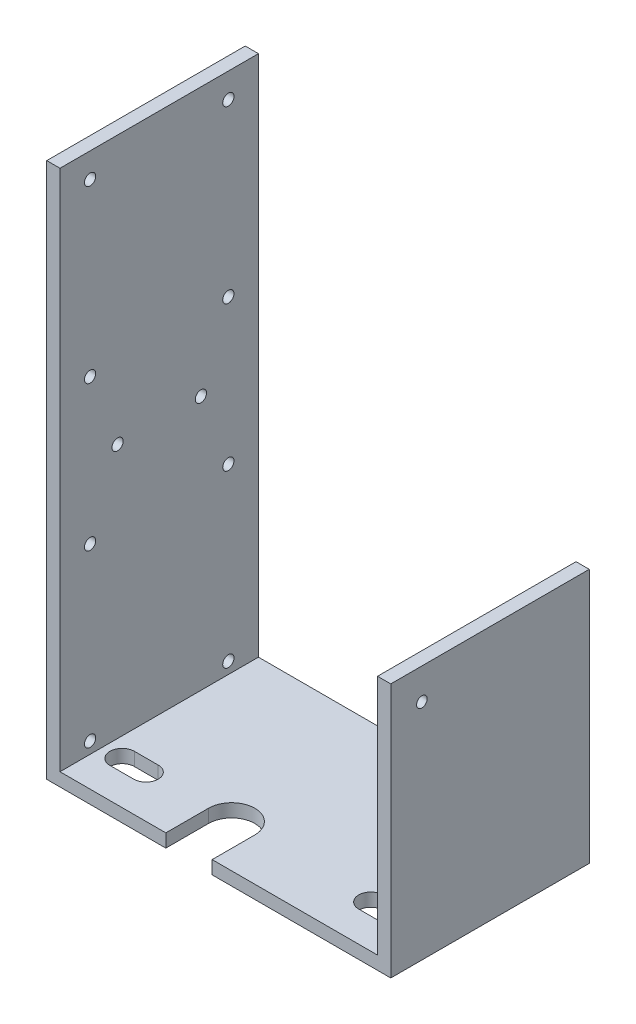
ISO-10303-21;
HEADER;
FILE_DESCRIPTION(('STEP AP214'),'2;1');
FILE_NAME('part.step','',(''),(''),'','','');
FILE_SCHEMA(('AUTOMOTIVE_DESIGN { 1 0 10303 214 1 1 1 1 }'));
ENDSEC;
DATA;
#1=APPLICATION_CONTEXT('core data for automotive mechanical design processes');
#2=APPLICATION_PROTOCOL_DEFINITION('international standard','automotive_design',2000,#1);
#3=PRODUCT_CONTEXT('',#1,'mechanical');
#4=PRODUCT('Part','Part','',(#3));
#5=PRODUCT_RELATED_PRODUCT_CATEGORY('part','',(#4));
#6=PRODUCT_DEFINITION_FORMATION('','',#4);
#7=PRODUCT_DEFINITION_CONTEXT('part definition',#1,'design');
#8=PRODUCT_DEFINITION('design','',#6,#7);
#9=PRODUCT_DEFINITION_SHAPE('','',#8);
#10=(LENGTH_UNIT() NAMED_UNIT(*) SI_UNIT(.MILLI.,.METRE.));
#11=(NAMED_UNIT(*) PLANE_ANGLE_UNIT() SI_UNIT($,.RADIAN.));
#12=(NAMED_UNIT(*) SI_UNIT($,.STERADIAN.) SOLID_ANGLE_UNIT());
#13=UNCERTAINTY_MEASURE_WITH_UNIT(LENGTH_MEASURE(1.E-05),#10,'distance_accuracy_value','');
#14=(GEOMETRIC_REPRESENTATION_CONTEXT(3) GLOBAL_UNCERTAINTY_ASSIGNED_CONTEXT((#13)) GLOBAL_UNIT_ASSIGNED_CONTEXT((#10,
#11,#12)) REPRESENTATION_CONTEXT('',''));
#15=CARTESIAN_POINT('',(0.,0.,0.));
#16=DIRECTION('',(0.,0.,1.));
#17=DIRECTION('',(1.,0.,0.));
#18=AXIS2_PLACEMENT_3D('',#15,#16,#17);
#19=CARTESIAN_POINT('',(0.,0.,30.));
#20=DIRECTION('',(0.,0.,-1.));
#21=DIRECTION('',(-1.,0.,0.));
#22=AXIS2_PLACEMENT_3D('',#19,#20,#21);
#23=PLANE('',#22);
#24=DIRECTION('',(1.,0.,0.));
#25=VECTOR('',#24,1.);
#26=CARTESIAN_POINT('',(52.,0.,30.));
#27=LINE('',#26,#25);
#28=CARTESIAN_POINT('',(0.,0.,30.));
#29=VERTEX_POINT('',#28);
#30=CARTESIAN_POINT('',(18.,0.,30.));
#31=VERTEX_POINT('',#30);
#32=EDGE_CURVE('E325',#29,#31,#27,.T.);
#33=ORIENTED_EDGE('',*,*,#32,.T.);
#34=DIRECTION('',(0.,-1.,0.));
#35=VECTOR('',#34,1.);
#36=CARTESIAN_POINT('',(18.,17.1625360675581,30.));
#37=LINE('',#36,#35);
#38=CARTESIAN_POINT('',(18.,1.99999999999999,30.));
#39=VERTEX_POINT('',#38);
#40=EDGE_CURVE('E197',#39,#31,#37,.T.);
#41=ORIENTED_EDGE('',*,*,#40,.F.);
#42=DIRECTION('',(-1.,0.,0.));
#43=VECTOR('',#42,1.);
#44=CARTESIAN_POINT('',(2.00000000000001,1.99999999999999,30.));
#45=LINE('',#44,#43);
#46=CARTESIAN_POINT('',(2.00000000000001,1.99999999999999,30.));
#47=VERTEX_POINT('',#46);
#48=EDGE_CURVE('E334',#39,#47,#45,.T.);
#49=ORIENTED_EDGE('',*,*,#48,.T.);
#50=DIRECTION('',(0.,1.,0.));
#51=VECTOR('',#50,1.);
#52=CARTESIAN_POINT('',(2.,81.,30.));
#53=LINE('',#52,#51);
#54=CARTESIAN_POINT('',(2.,81.,30.));
#55=VERTEX_POINT('',#54);
#56=EDGE_CURVE('E338',#47,#55,#53,.T.);
#57=ORIENTED_EDGE('',*,*,#56,.T.);
#58=DIRECTION('',(-1.,0.,0.));
#59=VECTOR('',#58,1.);
#60=CARTESIAN_POINT('',(0.,81.,30.));
#61=LINE('',#60,#59);
#62=CARTESIAN_POINT('',(0.,81.,30.));
#63=VERTEX_POINT('',#62);
#64=EDGE_CURVE('E340',#55,#63,#61,.T.);
#65=ORIENTED_EDGE('',*,*,#64,.T.);
#66=DIRECTION('',(0.,-1.,0.));
#67=VECTOR('',#66,1.);
#68=CARTESIAN_POINT('',(0.,0.,30.));
#69=LINE('',#68,#67);
#70=EDGE_CURVE('E342',#63,#29,#69,.T.);
#71=ORIENTED_EDGE('',*,*,#70,.T.);
#72=EDGE_LOOP('',(#33,#41,#49,#57,#65,#71));
#73=FACE_BOUND('',#72,.T.);
#74=ADVANCED_FACE('F33',(#73),#23,.F.);
#75=CARTESIAN_POINT('',(52.,0.,30.));
#76=DIRECTION('',(0.,1.,0.));
#77=DIRECTION('',(-1.,0.,0.));
#78=AXIS2_PLACEMENT_3D('',#75,#76,#77);
#79=PLANE('',#78);
#80=DIRECTION('',(1.,0.,0.));
#81=VECTOR('',#80,1.);
#82=CARTESIAN_POINT('',(42.55,0.,21.7));
#83=LINE('',#82,#81);
#84=CARTESIAN_POINT('',(42.55,0.,21.7));
#85=VERTEX_POINT('',#84);
#86=CARTESIAN_POINT('',(46.15,0.,21.7));
#87=VERTEX_POINT('',#86);
#88=EDGE_CURVE('E212',#85,#87,#83,.T.);
#89=ORIENTED_EDGE('',*,*,#88,.F.);
#90=CARTESIAN_POINT('',(42.55,0.,23.55));
#91=DIRECTION('',(0.,-1.,0.));
#92=DIRECTION('',(1.,0.,0.));
#93=AXIS2_PLACEMENT_3D('',#90,#91,#92);
#94=CIRCLE('',#93,1.85);
#95=CARTESIAN_POINT('',(42.55,0.,25.4));
#96=VERTEX_POINT('',#95);
#97=EDGE_CURVE('E56',#96,#85,#94,.T.);
#98=ORIENTED_EDGE('',*,*,#97,.F.);
#99=DIRECTION('',(-1.,0.,0.));
#100=VECTOR('',#99,1.);
#101=CARTESIAN_POINT('',(42.55,0.,25.4));
#102=LINE('',#101,#100);
#103=CARTESIAN_POINT('',(46.15,0.,25.4));
#104=VERTEX_POINT('',#103);
#105=EDGE_CURVE('E218',#104,#96,#102,.T.);
#106=ORIENTED_EDGE('',*,*,#105,.F.);
#107=CARTESIAN_POINT('',(46.15,0.,23.55));
#108=DIRECTION('',(0.,-1.,0.));
#109=DIRECTION('',(1.,0.,0.));
#110=AXIS2_PLACEMENT_3D('',#107,#108,#109);
#111=CIRCLE('',#110,1.85);
#112=EDGE_CURVE('E215',#87,#104,#111,.T.);
#113=ORIENTED_EDGE('',*,*,#112,.F.);
#114=EDGE_LOOP('',(#89,#98,#106,#113));
#115=FACE_BOUND('',#114,.T.);
#116=DIRECTION('',(1.,0.,0.));
#117=VECTOR('',#116,1.);
#118=CARTESIAN_POINT('',(4.95,0.,21.7));
#119=LINE('',#118,#117);
#120=CARTESIAN_POINT('',(4.95,0.,21.7));
#121=VERTEX_POINT('',#120);
#122=CARTESIAN_POINT('',(8.55,0.,21.7));
#123=VERTEX_POINT('',#122);
#124=EDGE_CURVE('E240',#121,#123,#119,.T.);
#125=ORIENTED_EDGE('',*,*,#124,.F.);
#126=CARTESIAN_POINT('',(4.95,0.,23.55));
#127=DIRECTION('',(0.,-1.,0.));
#128=DIRECTION('',(1.,0.,0.));
#129=AXIS2_PLACEMENT_3D('',#126,#127,#128);
#130=CIRCLE('',#129,1.85);
#131=CARTESIAN_POINT('',(4.95,0.,25.4));
#132=VERTEX_POINT('',#131);
#133=EDGE_CURVE('E229',#132,#121,#130,.T.);
#134=ORIENTED_EDGE('',*,*,#133,.F.);
#135=DIRECTION('',(-1.,0.,0.));
#136=VECTOR('',#135,1.);
#137=CARTESIAN_POINT('',(4.95,0.,25.4));
#138=LINE('',#137,#136);
#139=CARTESIAN_POINT('',(8.55,0.,25.4));
#140=VERTEX_POINT('',#139);
#141=EDGE_CURVE('E246',#140,#132,#138,.T.);
#142=ORIENTED_EDGE('',*,*,#141,.F.);
#143=CARTESIAN_POINT('',(8.55,0.,23.55));
#144=DIRECTION('',(0.,-1.,0.));
#145=DIRECTION('',(1.,0.,0.));
#146=AXIS2_PLACEMENT_3D('',#143,#144,#145);
#147=CIRCLE('',#146,1.85);
#148=EDGE_CURVE('E243',#123,#140,#147,.T.);
#149=ORIENTED_EDGE('',*,*,#148,.F.);
#150=EDGE_LOOP('',(#125,#134,#142,#149));
#151=FACE_BOUND('',#150,.T.);
#152=CARTESIAN_POINT('',(21.5,0.,23.55));
#153=DIRECTION('',(0.,-1.,0.));
#154=DIRECTION('',(1.,0.,0.));
#155=AXIS2_PLACEMENT_3D('',#152,#153,#154);
#156=CIRCLE('',#155,3.5);
#157=CARTESIAN_POINT('',(18.,0.,23.55));
#158=VERTEX_POINT('',#157);
#159=CARTESIAN_POINT('',(25.,0.,23.55));
#160=VERTEX_POINT('',#159);
#161=EDGE_CURVE('E180',#158,#160,#156,.T.);
#162=ORIENTED_EDGE('',*,*,#161,.F.);
#163=DIRECTION('',(0.,0.,-1.));
#164=VECTOR('',#163,1.);
#165=CARTESIAN_POINT('',(18.,0.,23.55));
#166=LINE('',#165,#164);
#167=EDGE_CURVE('E177',#31,#158,#166,.T.);
#168=ORIENTED_EDGE('',*,*,#167,.F.);
#169=ORIENTED_EDGE('',*,*,#32,.F.);
#170=DIRECTION('',(0.,0.,-1.));
#171=VECTOR('',#170,1.);
#172=CARTESIAN_POINT('',(0.,0.,30.));
#173=LINE('',#172,#171);
#174=CARTESIAN_POINT('',(0.,0.,0.));
#175=VERTEX_POINT('',#174);
#176=EDGE_CURVE('E344',#29,#175,#173,.T.);
#177=ORIENTED_EDGE('',*,*,#176,.T.);
#178=DIRECTION('',(1.,0.,0.));
#179=VECTOR('',#178,1.);
#180=CARTESIAN_POINT('',(52.,0.,0.));
#181=LINE('',#180,#179);
#182=CARTESIAN_POINT('',(52.,0.,0.));
#183=VERTEX_POINT('',#182);
#184=EDGE_CURVE('E324',#175,#183,#181,.T.);
#185=ORIENTED_EDGE('',*,*,#184,.T.);
#186=DIRECTION('',(0.,0.,-1.));
#187=VECTOR('',#186,1.);
#188=CARTESIAN_POINT('',(52.,0.,30.));
#189=LINE('',#188,#187);
#190=CARTESIAN_POINT('',(52.,0.,30.));
#191=VERTEX_POINT('',#190);
#192=EDGE_CURVE('E11',#191,#183,#189,.T.);
#193=ORIENTED_EDGE('',*,*,#192,.F.);
#194=CARTESIAN_POINT('',(25.,0.,30.));
#195=VERTEX_POINT('',#194);
#196=EDGE_CURVE('E190',#195,#191,#27,.T.);
#197=ORIENTED_EDGE('',*,*,#196,.F.);
#198=DIRECTION('',(0.,0.,1.));
#199=VECTOR('',#198,1.);
#200=CARTESIAN_POINT('',(25.,0.,23.55));
#201=LINE('',#200,#199);
#202=EDGE_CURVE('E48',#160,#195,#201,.T.);
#203=ORIENTED_EDGE('',*,*,#202,.F.);
#204=EDGE_LOOP('',(#162,#168,#169,#177,#185,#193,#197,#203));
#205=FACE_BOUND('',#204,.T.);
#206=ADVANCED_FACE('F35',(#115,#151,#205),#79,.F.);
#207=CARTESIAN_POINT('',(52.,38.5,30.));
#208=DIRECTION('',(-1.,0.,0.));
#209=DIRECTION('',(0.,-1.,0.));
#210=AXIS2_PLACEMENT_3D('',#207,#208,#209);
#211=PLANE('',#210);
#212=CARTESIAN_POINT('',(52.,33.8,25.3));
#213=DIRECTION('',(1.,0.,0.));
#214=DIRECTION('',(0.,1.,0.));
#215=AXIS2_PLACEMENT_3D('',#212,#213,#214);
#216=CIRCLE('',#215,0.800000000000003);
#217=CARTESIAN_POINT('',(52.,34.6,25.3));
#218=VERTEX_POINT('',#217);
#219=EDGE_CURVE('E318',#218,#218,#216,.T.);
#220=ORIENTED_EDGE('',*,*,#219,.F.);
#221=EDGE_LOOP('',(#220));
#222=FACE_BOUND('',#221,.T.);
#223=DIRECTION('',(0.,1.,0.));
#224=VECTOR('',#223,1.);
#225=CARTESIAN_POINT('',(52.,38.5,0.));
#226=LINE('',#225,#224);
#227=CARTESIAN_POINT('',(52.,38.5,0.));
#228=VERTEX_POINT('',#227);
#229=EDGE_CURVE('E347',#183,#228,#226,.T.);
#230=ORIENTED_EDGE('',*,*,#229,.T.);
#231=DIRECTION('',(0.,0.,-1.));
#232=VECTOR('',#231,1.);
#233=CARTESIAN_POINT('',(52.,38.5,30.));
#234=LINE('',#233,#232);
#235=CARTESIAN_POINT('',(52.,38.5,30.));
#236=VERTEX_POINT('',#235);
#237=EDGE_CURVE('E41',#236,#228,#234,.T.);
#238=ORIENTED_EDGE('',*,*,#237,.F.);
#239=DIRECTION('',(0.,1.,0.));
#240=VECTOR('',#239,1.);
#241=CARTESIAN_POINT('',(52.,38.5,30.));
#242=LINE('',#241,#240);
#243=EDGE_CURVE('E328',#191,#236,#242,.T.);
#244=ORIENTED_EDGE('',*,*,#243,.F.);
#245=ORIENTED_EDGE('',*,*,#192,.T.);
#246=EDGE_LOOP('',(#230,#238,#244,#245));
#247=FACE_BOUND('',#246,.T.);
#248=ADVANCED_FACE('F403',(#222,#247),#211,.F.);
#249=CARTESIAN_POINT('',(50.,38.5,30.));
#250=DIRECTION('',(0.,-1.,0.));
#251=DIRECTION('',(0.,0.,-1.));
#252=AXIS2_PLACEMENT_3D('',#249,#250,#251);
#253=PLANE('',#252);
#254=DIRECTION('',(-1.,0.,0.));
#255=VECTOR('',#254,1.);
#256=CARTESIAN_POINT('',(50.,38.5,0.));
#257=LINE('',#256,#255);
#258=CARTESIAN_POINT('',(50.,38.5,0.));
#259=VERTEX_POINT('',#258);
#260=EDGE_CURVE('E349',#228,#259,#257,.T.);
#261=ORIENTED_EDGE('',*,*,#260,.T.);
#262=DIRECTION('',(0.,0.,-1.));
#263=VECTOR('',#262,1.);
#264=CARTESIAN_POINT('',(50.,38.5,30.));
#265=LINE('',#264,#263);
#266=CARTESIAN_POINT('',(50.,38.5,30.));
#267=VERTEX_POINT('',#266);
#268=EDGE_CURVE('E375',#267,#259,#265,.T.);
#269=ORIENTED_EDGE('',*,*,#268,.F.);
#270=DIRECTION('',(-1.,0.,0.));
#271=VECTOR('',#270,1.);
#272=CARTESIAN_POINT('',(50.,38.5,30.));
#273=LINE('',#272,#271);
#274=EDGE_CURVE('E330',#236,#267,#273,.T.);
#275=ORIENTED_EDGE('',*,*,#274,.F.);
#276=ORIENTED_EDGE('',*,*,#237,.T.);
#277=EDGE_LOOP('',(#261,#269,#275,#276));
#278=FACE_BOUND('',#277,.T.);
#279=ADVANCED_FACE('F382',(#278),#253,.F.);
#280=CARTESIAN_POINT('',(50.,1.99999999999999,30.));
#281=DIRECTION('',(1.,0.,0.));
#282=DIRECTION('',(0.,0.,-1.));
#283=AXIS2_PLACEMENT_3D('',#280,#281,#282);
#284=PLANE('',#283);
#285=CARTESIAN_POINT('',(50.,33.8,25.3));
#286=DIRECTION('',(1.,0.,0.));
#287=DIRECTION('',(0.,0.,-1.));
#288=AXIS2_PLACEMENT_3D('',#285,#286,#287);
#289=CIRCLE('',#288,0.800000000000003);
#290=CARTESIAN_POINT('',(50.,33.8,24.5));
#291=VERTEX_POINT('',#290);
#292=EDGE_CURVE('E321',#291,#291,#289,.F.);
#293=ORIENTED_EDGE('',*,*,#292,.F.);
#294=EDGE_LOOP('',(#293));
#295=FACE_BOUND('',#294,.T.);
#296=DIRECTION('',(0.,-1.,0.));
#297=VECTOR('',#296,1.);
#298=CARTESIAN_POINT('',(50.,1.99999999999999,0.));
#299=LINE('',#298,#297);
#300=CARTESIAN_POINT('',(50.,1.99999999999999,0.));
#301=VERTEX_POINT('',#300);
#302=EDGE_CURVE('E351',#259,#301,#299,.T.);
#303=ORIENTED_EDGE('',*,*,#302,.T.);
#304=DIRECTION('',(0.,0.,-1.));
#305=VECTOR('',#304,1.);
#306=CARTESIAN_POINT('',(50.,1.99999999999999,30.));
#307=LINE('',#306,#305);
#308=CARTESIAN_POINT('',(50.,1.99999999999999,30.));
#309=VERTEX_POINT('',#308);
#310=EDGE_CURVE('E372',#309,#301,#307,.T.);
#311=ORIENTED_EDGE('',*,*,#310,.F.);
#312=DIRECTION('',(0.,-1.,0.));
#313=VECTOR('',#312,1.);
#314=CARTESIAN_POINT('',(50.,1.99999999999999,30.));
#315=LINE('',#314,#313);
#316=EDGE_CURVE('E332',#267,#309,#315,.T.);
#317=ORIENTED_EDGE('',*,*,#316,.F.);
#318=ORIENTED_EDGE('',*,*,#268,.T.);
#319=EDGE_LOOP('',(#303,#311,#317,#318));
#320=FACE_BOUND('',#319,.T.);
#321=ADVANCED_FACE('F394',(#295,#320),#284,.F.);
#322=CARTESIAN_POINT('',(2.00000000000001,1.99999999999999,30.));
#323=DIRECTION('',(0.,-1.,0.));
#324=DIRECTION('',(1.,0.,0.));
#325=AXIS2_PLACEMENT_3D('',#322,#323,#324);
#326=PLANE('',#325);
#327=DIRECTION('',(1.,0.,0.));
#328=VECTOR('',#327,1.);
#329=CARTESIAN_POINT('',(42.55,1.99999999999999,25.4));
#330=LINE('',#329,#328);
#331=CARTESIAN_POINT('',(42.55,1.99999999999999,25.4));
#332=VERTEX_POINT('',#331);
#333=CARTESIAN_POINT('',(46.15,1.99999999999999,25.4));
#334=VERTEX_POINT('',#333);
#335=EDGE_CURVE('E205',#332,#334,#330,.T.);
#336=ORIENTED_EDGE('',*,*,#335,.F.);
#337=CARTESIAN_POINT('',(42.55,1.99999999999999,23.55));
#338=DIRECTION('',(0.,-1.,0.));
#339=DIRECTION('',(1.,0.,0.));
#340=AXIS2_PLACEMENT_3D('',#337,#338,#339);
#341=CIRCLE('',#340,1.85);
#342=CARTESIAN_POINT('',(42.55,1.99999999999999,21.7));
#343=VERTEX_POINT('',#342);
#344=EDGE_CURVE('E208',#343,#332,#341,.F.);
#345=ORIENTED_EDGE('',*,*,#344,.F.);
#346=DIRECTION('',(-1.,0.,0.));
#347=VECTOR('',#346,1.);
#348=CARTESIAN_POINT('',(42.55,1.99999999999999,21.7));
#349=LINE('',#348,#347);
#350=CARTESIAN_POINT('',(46.15,1.99999999999999,21.7));
#351=VERTEX_POINT('',#350);
#352=EDGE_CURVE('E210',#351,#343,#349,.T.);
#353=ORIENTED_EDGE('',*,*,#352,.F.);
#354=CARTESIAN_POINT('',(46.15,1.99999999999999,23.55));
#355=DIRECTION('',(0.,-1.,0.));
#356=DIRECTION('',(1.,0.,0.));
#357=AXIS2_PLACEMENT_3D('',#354,#355,#356);
#358=CIRCLE('',#357,1.85);
#359=EDGE_CURVE('E202',#334,#351,#358,.F.);
#360=ORIENTED_EDGE('',*,*,#359,.F.);
#361=EDGE_LOOP('',(#336,#345,#353,#360));
#362=FACE_BOUND('',#361,.T.);
#363=DIRECTION('',(1.,0.,0.));
#364=VECTOR('',#363,1.);
#365=CARTESIAN_POINT('',(4.95,1.99999999999999,25.4));
#366=LINE('',#365,#364);
#367=CARTESIAN_POINT('',(4.95,1.99999999999999,25.4));
#368=VERTEX_POINT('',#367);
#369=CARTESIAN_POINT('',(8.55,1.99999999999999,25.4));
#370=VERTEX_POINT('',#369);
#371=EDGE_CURVE('E233',#368,#370,#366,.T.);
#372=ORIENTED_EDGE('',*,*,#371,.F.);
#373=CARTESIAN_POINT('',(4.95,1.99999999999999,23.55));
#374=DIRECTION('',(0.,-1.,0.));
#375=DIRECTION('',(1.,0.,0.));
#376=AXIS2_PLACEMENT_3D('',#373,#374,#375);
#377=CIRCLE('',#376,1.85);
#378=CARTESIAN_POINT('',(4.95,1.99999999999999,21.7));
#379=VERTEX_POINT('',#378);
#380=EDGE_CURVE('E236',#379,#368,#377,.F.);
#381=ORIENTED_EDGE('',*,*,#380,.F.);
#382=DIRECTION('',(-1.,0.,0.));
#383=VECTOR('',#382,1.);
#384=CARTESIAN_POINT('',(4.95,1.99999999999999,21.7));
#385=LINE('',#384,#383);
#386=CARTESIAN_POINT('',(8.55,1.99999999999999,21.7));
#387=VERTEX_POINT('',#386);
#388=EDGE_CURVE('E238',#387,#379,#385,.T.);
#389=ORIENTED_EDGE('',*,*,#388,.F.);
#390=CARTESIAN_POINT('',(8.55,1.99999999999999,23.55));
#391=DIRECTION('',(0.,-1.,0.));
#392=DIRECTION('',(1.,0.,0.));
#393=AXIS2_PLACEMENT_3D('',#390,#391,#392);
#394=CIRCLE('',#393,1.85);
#395=EDGE_CURVE('E230',#370,#387,#394,.F.);
#396=ORIENTED_EDGE('',*,*,#395,.F.);
#397=EDGE_LOOP('',(#372,#381,#389,#396));
#398=FACE_BOUND('',#397,.T.);
#399=ORIENTED_EDGE('',*,*,#48,.F.);
#400=DIRECTION('',(0.,0.,1.));
#401=VECTOR('',#400,1.);
#402=CARTESIAN_POINT('',(18.,1.99999999999999,23.55));
#403=LINE('',#402,#401);
#404=CARTESIAN_POINT('',(18.,1.99999999999999,23.55));
#405=VERTEX_POINT('',#404);
#406=EDGE_CURVE('E196',#405,#39,#403,.T.);
#407=ORIENTED_EDGE('',*,*,#406,.F.);
#408=CARTESIAN_POINT('',(21.5,1.99999999999999,23.55));
#409=DIRECTION('',(0.,-1.,0.));
#410=DIRECTION('',(1.,0.,0.));
#411=AXIS2_PLACEMENT_3D('',#408,#409,#410);
#412=CIRCLE('',#411,3.5);
#413=CARTESIAN_POINT('',(25.,1.99999999999999,23.55));
#414=VERTEX_POINT('',#413);
#415=EDGE_CURVE('E201',#414,#405,#412,.F.);
#416=ORIENTED_EDGE('',*,*,#415,.F.);
#417=DIRECTION('',(0.,0.,-1.));
#418=VECTOR('',#417,1.);
#419=CARTESIAN_POINT('',(25.,1.99999999999999,23.55));
#420=LINE('',#419,#418);
#421=CARTESIAN_POINT('',(25.,1.99999999999999,30.));
#422=VERTEX_POINT('',#421);
#423=EDGE_CURVE('E173',#422,#414,#420,.T.);
#424=ORIENTED_EDGE('',*,*,#423,.F.);
#425=EDGE_CURVE('E335',#309,#422,#45,.T.);
#426=ORIENTED_EDGE('',*,*,#425,.F.);
#427=ORIENTED_EDGE('',*,*,#310,.T.);
#428=DIRECTION('',(-1.,0.,0.));
#429=VECTOR('',#428,1.);
#430=CARTESIAN_POINT('',(2.00000000000001,1.99999999999999,0.));
#431=LINE('',#430,#429);
#432=CARTESIAN_POINT('',(2.00000000000001,1.99999999999999,0.));
#433=VERTEX_POINT('',#432);
#434=EDGE_CURVE('E353',#301,#433,#431,.T.);
#435=ORIENTED_EDGE('',*,*,#434,.T.);
#436=DIRECTION('',(0.,0.,-1.));
#437=VECTOR('',#436,1.);
#438=CARTESIAN_POINT('',(2.00000000000001,1.99999999999999,30.));
#439=LINE('',#438,#437);
#440=EDGE_CURVE('E369',#47,#433,#439,.T.);
#441=ORIENTED_EDGE('',*,*,#440,.F.);
#442=EDGE_LOOP('',(#399,#407,#416,#424,#426,#427,#435,#441));
#443=FACE_BOUND('',#442,.T.);
#444=ADVANCED_FACE('F399',(#362,#398,#443),#326,.F.);
#445=CARTESIAN_POINT('',(2.,81.,30.));
#446=DIRECTION('',(-1.,0.,0.));
#447=DIRECTION('',(0.,-1.,0.));
#448=AXIS2_PLACEMENT_3D('',#445,#446,#447);
#449=PLANE('',#448);
#450=CARTESIAN_POINT('',(2.,40.5,21.3));
#451=DIRECTION('',(-1.,0.,0.));
#452=DIRECTION('',(0.,-1.,0.));
#453=AXIS2_PLACEMENT_3D('',#450,#451,#452);
#454=CIRCLE('',#453,0.850000000000001);
#455=CARTESIAN_POINT('',(2.,39.65,21.3));
#456=VERTEX_POINT('',#455);
#457=EDGE_CURVE('E261',#456,#456,#454,.F.);
#458=ORIENTED_EDGE('',*,*,#457,.F.);
#459=EDGE_LOOP('',(#458));
#460=FACE_BOUND('',#459,.T.);
#461=CARTESIAN_POINT('',(2.,40.5,8.7));
#462=DIRECTION('',(-1.,0.,0.));
#463=DIRECTION('',(0.,-1.,0.));
#464=AXIS2_PLACEMENT_3D('',#461,#462,#463);
#465=CIRCLE('',#464,0.850000000000001);
#466=CARTESIAN_POINT('',(2.,39.65,8.7));
#467=VERTEX_POINT('',#466);
#468=EDGE_CURVE('E267',#467,#467,#465,.F.);
#469=ORIENTED_EDGE('',*,*,#468,.F.);
#470=EDGE_LOOP('',(#469));
#471=FACE_BOUND('',#470,.T.);
#472=CARTESIAN_POINT('',(2.00000000000001,3.75,4.55));
#473=DIRECTION('',(-1.,0.,0.));
#474=DIRECTION('',(0.,-1.,0.));
#475=AXIS2_PLACEMENT_3D('',#472,#473,#474);
#476=CIRCLE('',#475,0.850000000000002);
#477=CARTESIAN_POINT('',(2.00000000000001,2.9,4.55));
#478=VERTEX_POINT('',#477);
#479=EDGE_CURVE('E273',#478,#478,#476,.F.);
#480=ORIENTED_EDGE('',*,*,#479,.F.);
#481=EDGE_LOOP('',(#480));
#482=FACE_BOUND('',#481,.T.);
#483=CARTESIAN_POINT('',(2.00000000000001,3.75,25.45));
#484=DIRECTION('',(-1.,0.,0.));
#485=DIRECTION('',(0.,-1.,0.));
#486=AXIS2_PLACEMENT_3D('',#483,#484,#485);
#487=CIRCLE('',#486,0.850000000000001);
#488=CARTESIAN_POINT('',(2.00000000000001,2.9,25.45));
#489=VERTEX_POINT('',#488);
#490=EDGE_CURVE('E279',#489,#489,#487,.F.);
#491=ORIENTED_EDGE('',*,*,#490,.F.);
#492=EDGE_LOOP('',(#491));
#493=FACE_BOUND('',#492,.T.);
#494=CARTESIAN_POINT('',(2.00000000000001,29.55,4.55));
#495=DIRECTION('',(-1.,0.,0.));
#496=DIRECTION('',(0.,-1.,0.));
#497=AXIS2_PLACEMENT_3D('',#494,#495,#496);
#498=CIRCLE('',#497,0.850000000000003);
#499=CARTESIAN_POINT('',(2.00000000000001,28.7,4.55));
#500=VERTEX_POINT('',#499);
#501=EDGE_CURVE('E285',#500,#500,#498,.F.);
#502=ORIENTED_EDGE('',*,*,#501,.F.);
#503=EDGE_LOOP('',(#502));
#504=FACE_BOUND('',#503,.T.);
#505=CARTESIAN_POINT('',(2.00000000000001,29.55,25.45));
#506=DIRECTION('',(-1.,0.,0.));
#507=DIRECTION('',(0.,-1.,0.));
#508=AXIS2_PLACEMENT_3D('',#505,#506,#507);
#509=CIRCLE('',#508,0.850000000000001);
#510=CARTESIAN_POINT('',(2.00000000000001,28.7,25.45));
#511=VERTEX_POINT('',#510);
#512=EDGE_CURVE('E291',#511,#511,#509,.F.);
#513=ORIENTED_EDGE('',*,*,#512,.F.);
#514=EDGE_LOOP('',(#513));
#515=FACE_BOUND('',#514,.T.);
#516=CARTESIAN_POINT('',(2.,51.45,4.55));
#517=DIRECTION('',(-1.,0.,0.));
#518=DIRECTION('',(0.,-1.,0.));
#519=AXIS2_PLACEMENT_3D('',#516,#517,#518);
#520=CIRCLE('',#519,0.850000000000003);
#521=CARTESIAN_POINT('',(2.,50.6,4.55));
#522=VERTEX_POINT('',#521);
#523=EDGE_CURVE('E297',#522,#522,#520,.F.);
#524=ORIENTED_EDGE('',*,*,#523,.F.);
#525=EDGE_LOOP('',(#524));
#526=FACE_BOUND('',#525,.T.);
#527=CARTESIAN_POINT('',(2.,51.45,25.45));
#528=DIRECTION('',(-1.,0.,0.));
#529=DIRECTION('',(0.,-1.,0.));
#530=AXIS2_PLACEMENT_3D('',#527,#528,#529);
#531=CIRCLE('',#530,0.850000000000001);
#532=CARTESIAN_POINT('',(2.,50.6,25.45));
#533=VERTEX_POINT('',#532);
#534=EDGE_CURVE('E303',#533,#533,#531,.F.);
#535=ORIENTED_EDGE('',*,*,#534,.F.);
#536=EDGE_LOOP('',(#535));
#537=FACE_BOUND('',#536,.T.);
#538=CARTESIAN_POINT('',(2.,77.25,25.45));
#539=DIRECTION('',(-1.,0.,0.));
#540=DIRECTION('',(0.,-1.,0.));
#541=AXIS2_PLACEMENT_3D('',#538,#539,#540);
#542=CIRCLE('',#541,0.850000000000001);
#543=CARTESIAN_POINT('',(2.,76.4,25.45));
#544=VERTEX_POINT('',#543);
#545=EDGE_CURVE('E309',#544,#544,#542,.F.);
#546=ORIENTED_EDGE('',*,*,#545,.F.);
#547=EDGE_LOOP('',(#546));
#548=FACE_BOUND('',#547,.T.);
#549=CARTESIAN_POINT('',(2.,77.25,4.55));
#550=DIRECTION('',(-1.,0.,0.));
#551=DIRECTION('',(0.,-1.,0.));
#552=AXIS2_PLACEMENT_3D('',#549,#550,#551);
#553=CIRCLE('',#552,0.850000000000002);
#554=CARTESIAN_POINT('',(2.,76.4,4.55));
#555=VERTEX_POINT('',#554);
#556=EDGE_CURVE('E315',#555,#555,#553,.F.);
#557=ORIENTED_EDGE('',*,*,#556,.F.);
#558=EDGE_LOOP('',(#557));
#559=FACE_BOUND('',#558,.T.);
#560=DIRECTION('',(0.,1.,0.));
#561=VECTOR('',#560,1.);
#562=CARTESIAN_POINT('',(2.,81.,0.));
#563=LINE('',#562,#561);
#564=CARTESIAN_POINT('',(2.,81.,0.));
#565=VERTEX_POINT('',#564);
#566=EDGE_CURVE('E355',#433,#565,#563,.T.);
#567=ORIENTED_EDGE('',*,*,#566,.T.);
#568=DIRECTION('',(0.,0.,-1.));
#569=VECTOR('',#568,1.);
#570=CARTESIAN_POINT('',(2.,81.,30.));
#571=LINE('',#570,#569);
#572=EDGE_CURVE('E366',#55,#565,#571,.T.);
#573=ORIENTED_EDGE('',*,*,#572,.F.);
#574=ORIENTED_EDGE('',*,*,#56,.F.);
#575=ORIENTED_EDGE('',*,*,#440,.T.);
#576=EDGE_LOOP('',(#567,#573,#574,#575));
#577=FACE_BOUND('',#576,.T.);
#578=ADVANCED_FACE('F418',(#460,#471,#482,#493,#504,#515,#526,#537,#548,#559,#577),#449,.F.);
#579=CARTESIAN_POINT('',(0.,81.,30.));
#580=DIRECTION('',(0.,-1.,0.));
#581=DIRECTION('',(0.,0.,-1.));
#582=AXIS2_PLACEMENT_3D('',#579,#580,#581);
#583=PLANE('',#582);
#584=DIRECTION('',(-1.,0.,0.));
#585=VECTOR('',#584,1.);
#586=CARTESIAN_POINT('',(0.,81.,0.));
#587=LINE('',#586,#585);
#588=CARTESIAN_POINT('',(0.,81.,0.));
#589=VERTEX_POINT('',#588);
#590=EDGE_CURVE('E357',#565,#589,#587,.T.);
#591=ORIENTED_EDGE('',*,*,#590,.T.);
#592=DIRECTION('',(0.,0.,-1.));
#593=VECTOR('',#592,1.);
#594=CARTESIAN_POINT('',(0.,81.,30.));
#595=LINE('',#594,#593);
#596=EDGE_CURVE('E363',#63,#589,#595,.T.);
#597=ORIENTED_EDGE('',*,*,#596,.F.);
#598=ORIENTED_EDGE('',*,*,#64,.F.);
#599=ORIENTED_EDGE('',*,*,#572,.T.);
#600=EDGE_LOOP('',(#591,#597,#598,#599));
#601=FACE_BOUND('',#600,.T.);
#602=ADVANCED_FACE('F414',(#601),#583,.F.);
#603=CARTESIAN_POINT('',(0.,0.,30.));
#604=DIRECTION('',(1.,0.,0.));
#605=DIRECTION('',(0.,0.,-1.));
#606=AXIS2_PLACEMENT_3D('',#603,#604,#605);
#607=PLANE('',#606);
#608=CARTESIAN_POINT('',(0.,40.5,21.3));
#609=DIRECTION('',(-1.,0.,0.));
#610=DIRECTION('',(0.,0.,1.));
#611=AXIS2_PLACEMENT_3D('',#608,#609,#610);
#612=CIRCLE('',#611,0.850000000000001);
#613=CARTESIAN_POINT('',(0.,40.5,22.15));
#614=VERTEX_POINT('',#613);
#615=EDGE_CURVE('E258',#614,#614,#612,.T.);
#616=ORIENTED_EDGE('',*,*,#615,.F.);
#617=EDGE_LOOP('',(#616));
#618=FACE_BOUND('',#617,.T.);
#619=CARTESIAN_POINT('',(0.,40.5,8.7));
#620=DIRECTION('',(-1.,0.,0.));
#621=DIRECTION('',(0.,0.,1.));
#622=AXIS2_PLACEMENT_3D('',#619,#620,#621);
#623=CIRCLE('',#622,0.850000000000001);
#624=CARTESIAN_POINT('',(0.,40.5,9.55));
#625=VERTEX_POINT('',#624);
#626=EDGE_CURVE('E264',#625,#625,#623,.T.);
#627=ORIENTED_EDGE('',*,*,#626,.F.);
#628=EDGE_LOOP('',(#627));
#629=FACE_BOUND('',#628,.T.);
#630=CARTESIAN_POINT('',(0.,3.75,4.55));
#631=DIRECTION('',(-1.,0.,0.));
#632=DIRECTION('',(0.,0.,-1.));
#633=AXIS2_PLACEMENT_3D('',#630,#631,#632);
#634=CIRCLE('',#633,0.850000000000002);
#635=CARTESIAN_POINT('',(0.,3.75,3.7));
#636=VERTEX_POINT('',#635);
#637=EDGE_CURVE('E270',#636,#636,#634,.T.);
#638=ORIENTED_EDGE('',*,*,#637,.F.);
#639=EDGE_LOOP('',(#638));
#640=FACE_BOUND('',#639,.T.);
#641=CARTESIAN_POINT('',(0.,3.75,25.45));
#642=DIRECTION('',(-1.,0.,0.));
#643=DIRECTION('',(0.,0.,-1.));
#644=AXIS2_PLACEMENT_3D('',#641,#642,#643);
#645=CIRCLE('',#644,0.850000000000001);
#646=CARTESIAN_POINT('',(0.,3.75,24.6));
#647=VERTEX_POINT('',#646);
#648=EDGE_CURVE('E276',#647,#647,#645,.T.);
#649=ORIENTED_EDGE('',*,*,#648,.F.);
#650=EDGE_LOOP('',(#649));
#651=FACE_BOUND('',#650,.T.);
#652=CARTESIAN_POINT('',(0.,29.55,4.55));
#653=DIRECTION('',(-1.,0.,0.));
#654=DIRECTION('',(0.,0.,-1.));
#655=AXIS2_PLACEMENT_3D('',#652,#653,#654);
#656=CIRCLE('',#655,0.850000000000003);
#657=CARTESIAN_POINT('',(0.,29.55,3.7));
#658=VERTEX_POINT('',#657);
#659=EDGE_CURVE('E282',#658,#658,#656,.T.);
#660=ORIENTED_EDGE('',*,*,#659,.F.);
#661=EDGE_LOOP('',(#660));
#662=FACE_BOUND('',#661,.T.);
#663=CARTESIAN_POINT('',(0.,29.55,25.45));
#664=DIRECTION('',(-1.,0.,0.));
#665=DIRECTION('',(0.,0.,-1.));
#666=AXIS2_PLACEMENT_3D('',#663,#664,#665);
#667=CIRCLE('',#666,0.850000000000001);
#668=CARTESIAN_POINT('',(0.,29.55,24.6));
#669=VERTEX_POINT('',#668);
#670=EDGE_CURVE('E288',#669,#669,#667,.T.);
#671=ORIENTED_EDGE('',*,*,#670,.F.);
#672=EDGE_LOOP('',(#671));
#673=FACE_BOUND('',#672,.T.);
#674=CARTESIAN_POINT('',(0.,51.45,4.55));
#675=DIRECTION('',(-1.,0.,0.));
#676=DIRECTION('',(0.,0.,1.));
#677=AXIS2_PLACEMENT_3D('',#674,#675,#676);
#678=CIRCLE('',#677,0.850000000000003);
#679=CARTESIAN_POINT('',(0.,51.45,5.4));
#680=VERTEX_POINT('',#679);
#681=EDGE_CURVE('E294',#680,#680,#678,.T.);
#682=ORIENTED_EDGE('',*,*,#681,.F.);
#683=EDGE_LOOP('',(#682));
#684=FACE_BOUND('',#683,.T.);
#685=CARTESIAN_POINT('',(0.,51.45,25.45));
#686=DIRECTION('',(-1.,0.,0.));
#687=DIRECTION('',(0.,0.,1.));
#688=AXIS2_PLACEMENT_3D('',#685,#686,#687);
#689=CIRCLE('',#688,0.850000000000001);
#690=CARTESIAN_POINT('',(0.,51.45,26.3));
#691=VERTEX_POINT('',#690);
#692=EDGE_CURVE('E300',#691,#691,#689,.T.);
#693=ORIENTED_EDGE('',*,*,#692,.F.);
#694=EDGE_LOOP('',(#693));
#695=FACE_BOUND('',#694,.T.);
#696=CARTESIAN_POINT('',(0.,77.25,25.45));
#697=DIRECTION('',(-1.,0.,0.));
#698=DIRECTION('',(0.,0.,1.));
#699=AXIS2_PLACEMENT_3D('',#696,#697,#698);
#700=CIRCLE('',#699,0.850000000000001);
#701=CARTESIAN_POINT('',(0.,77.25,26.3));
#702=VERTEX_POINT('',#701);
#703=EDGE_CURVE('E306',#702,#702,#700,.T.);
#704=ORIENTED_EDGE('',*,*,#703,.F.);
#705=EDGE_LOOP('',(#704));
#706=FACE_BOUND('',#705,.T.);
#707=CARTESIAN_POINT('',(0.,77.25,4.55));
#708=DIRECTION('',(-1.,0.,0.));
#709=DIRECTION('',(0.,0.,1.));
#710=AXIS2_PLACEMENT_3D('',#707,#708,#709);
#711=CIRCLE('',#710,0.850000000000002);
#712=CARTESIAN_POINT('',(0.,77.25,5.4));
#713=VERTEX_POINT('',#712);
#714=EDGE_CURVE('E312',#713,#713,#711,.T.);
#715=ORIENTED_EDGE('',*,*,#714,.F.);
#716=EDGE_LOOP('',(#715));
#717=FACE_BOUND('',#716,.T.);
#718=DIRECTION('',(0.,-1.,0.));
#719=VECTOR('',#718,1.);
#720=CARTESIAN_POINT('',(0.,0.,0.));
#721=LINE('',#720,#719);
#722=EDGE_CURVE('E359',#589,#175,#721,.T.);
#723=ORIENTED_EDGE('',*,*,#722,.T.);
#724=ORIENTED_EDGE('',*,*,#176,.F.);
#725=ORIENTED_EDGE('',*,*,#70,.F.);
#726=ORIENTED_EDGE('',*,*,#596,.T.);
#727=EDGE_LOOP('',(#723,#724,#725,#726));
#728=FACE_BOUND('',#727,.T.);
#729=ADVANCED_FACE('F409',(#618,#629,#640,#651,#662,#673,#684,#695,#706,#717,#728),#607,.F.);
#730=ORIENTED_EDGE('',*,*,#425,.T.);
#731=DIRECTION('',(0.,-1.,0.));
#732=VECTOR('',#731,1.);
#733=CARTESIAN_POINT('',(25.,17.1625360675581,30.));
#734=LINE('',#733,#732);
#735=EDGE_CURVE('E176',#422,#195,#734,.T.);
#736=ORIENTED_EDGE('',*,*,#735,.T.);
#737=ORIENTED_EDGE('',*,*,#196,.T.);
#738=ORIENTED_EDGE('',*,*,#243,.T.);
#739=ORIENTED_EDGE('',*,*,#274,.T.);
#740=ORIENTED_EDGE('',*,*,#316,.T.);
#741=EDGE_LOOP('',(#730,#736,#737,#738,#739,#740));
#742=FACE_BOUND('',#741,.T.);
#743=ADVANCED_FACE('F402',(#742),#23,.F.);
#744=CARTESIAN_POINT('',(0.,0.,0.));
#745=DIRECTION('',(0.,0.,-1.));
#746=DIRECTION('',(-1.,0.,0.));
#747=AXIS2_PLACEMENT_3D('',#744,#745,#746);
#748=PLANE('',#747);
#749=ORIENTED_EDGE('',*,*,#184,.F.);
#750=ORIENTED_EDGE('',*,*,#722,.F.);
#751=ORIENTED_EDGE('',*,*,#590,.F.);
#752=ORIENTED_EDGE('',*,*,#566,.F.);
#753=ORIENTED_EDGE('',*,*,#434,.F.);
#754=ORIENTED_EDGE('',*,*,#302,.F.);
#755=ORIENTED_EDGE('',*,*,#260,.F.);
#756=ORIENTED_EDGE('',*,*,#229,.F.);
#757=EDGE_LOOP('',(#749,#750,#751,#752,#753,#754,#755,#756));
#758=FACE_BOUND('',#757,.T.);
#759=ADVANCED_FACE('F389',(#758),#748,.T.);
#760=CARTESIAN_POINT('',(47.737258300203,33.8,25.3));
#761=DIRECTION('',(1.,0.,0.));
#762=DIRECTION('',(0.,1.,0.));
#763=AXIS2_PLACEMENT_3D('',#760,#761,#762);
#764=CYLINDRICAL_SURFACE('',#763,0.800000000000003);
#765=ORIENTED_EDGE('',*,*,#292,.T.);
#766=EDGE_LOOP('',(#765));
#767=FACE_BOUND('',#766,.T.);
#768=ORIENTED_EDGE('',*,*,#219,.T.);
#769=EDGE_LOOP('',(#768));
#770=FACE_BOUND('',#769,.T.);
#771=ADVANCED_FACE('F449',(#767,#770),#764,.F.);
#772=CARTESIAN_POINT('',(4.40416305603428,77.25,4.55));
#773=DIRECTION('',(-1.,0.,0.));
#774=DIRECTION('',(0.,0.,1.));
#775=AXIS2_PLACEMENT_3D('',#772,#773,#774);
#776=CYLINDRICAL_SURFACE('',#775,0.850000000000002);
#777=ORIENTED_EDGE('',*,*,#556,.T.);
#778=EDGE_LOOP('',(#777));
#779=FACE_BOUND('',#778,.T.);
#780=ORIENTED_EDGE('',*,*,#714,.T.);
#781=EDGE_LOOP('',(#780));
#782=FACE_BOUND('',#781,.T.);
#783=ADVANCED_FACE('F478',(#779,#782),#776,.F.);
#784=CARTESIAN_POINT('',(4.40416305603428,77.25,25.45));
#785=DIRECTION('',(-1.,0.,0.));
#786=DIRECTION('',(0.,0.,1.));
#787=AXIS2_PLACEMENT_3D('',#784,#785,#786);
#788=CYLINDRICAL_SURFACE('',#787,0.850000000000001);
#789=ORIENTED_EDGE('',*,*,#545,.T.);
#790=EDGE_LOOP('',(#789));
#791=FACE_BOUND('',#790,.T.);
#792=ORIENTED_EDGE('',*,*,#703,.T.);
#793=EDGE_LOOP('',(#792));
#794=FACE_BOUND('',#793,.T.);
#795=ADVANCED_FACE('F483',(#791,#794),#788,.F.);
#796=CARTESIAN_POINT('',(4.40416305603428,51.45,25.45));
#797=DIRECTION('',(-1.,0.,0.));
#798=DIRECTION('',(0.,0.,1.));
#799=AXIS2_PLACEMENT_3D('',#796,#797,#798);
#800=CYLINDRICAL_SURFACE('',#799,0.850000000000001);
#801=ORIENTED_EDGE('',*,*,#534,.T.);
#802=EDGE_LOOP('',(#801));
#803=FACE_BOUND('',#802,.T.);
#804=ORIENTED_EDGE('',*,*,#692,.T.);
#805=EDGE_LOOP('',(#804));
#806=FACE_BOUND('',#805,.T.);
#807=ADVANCED_FACE('F489',(#803,#806),#800,.F.);
#808=CARTESIAN_POINT('',(4.40416305603428,51.45,4.55));
#809=DIRECTION('',(-1.,0.,0.));
#810=DIRECTION('',(0.,0.,1.));
#811=AXIS2_PLACEMENT_3D('',#808,#809,#810);
#812=CYLINDRICAL_SURFACE('',#811,0.850000000000003);
#813=ORIENTED_EDGE('',*,*,#523,.T.);
#814=EDGE_LOOP('',(#813));
#815=FACE_BOUND('',#814,.T.);
#816=ORIENTED_EDGE('',*,*,#681,.T.);
#817=EDGE_LOOP('',(#816));
#818=FACE_BOUND('',#817,.T.);
#819=ADVANCED_FACE('F493',(#815,#818),#812,.F.);
#820=CARTESIAN_POINT('',(4.40416305603428,29.55,25.45));
#821=DIRECTION('',(-1.,0.,0.));
#822=DIRECTION('',(0.,0.,1.));
#823=AXIS2_PLACEMENT_3D('',#820,#821,#822);
#824=CYLINDRICAL_SURFACE('',#823,0.850000000000001);
#825=ORIENTED_EDGE('',*,*,#512,.T.);
#826=EDGE_LOOP('',(#825));
#827=FACE_BOUND('',#826,.T.);
#828=ORIENTED_EDGE('',*,*,#670,.T.);
#829=EDGE_LOOP('',(#828));
#830=FACE_BOUND('',#829,.T.);
#831=ADVANCED_FACE('F497',(#827,#830),#824,.F.);
#832=CARTESIAN_POINT('',(4.40416305603428,29.55,4.55));
#833=DIRECTION('',(-1.,0.,0.));
#834=DIRECTION('',(0.,0.,1.));
#835=AXIS2_PLACEMENT_3D('',#832,#833,#834);
#836=CYLINDRICAL_SURFACE('',#835,0.850000000000003);
#837=ORIENTED_EDGE('',*,*,#501,.T.);
#838=EDGE_LOOP('',(#837));
#839=FACE_BOUND('',#838,.T.);
#840=ORIENTED_EDGE('',*,*,#659,.T.);
#841=EDGE_LOOP('',(#840));
#842=FACE_BOUND('',#841,.T.);
#843=ADVANCED_FACE('F501',(#839,#842),#836,.F.);
#844=CARTESIAN_POINT('',(4.40416305603428,3.75,25.45));
#845=DIRECTION('',(-1.,0.,0.));
#846=DIRECTION('',(0.,0.,1.));
#847=AXIS2_PLACEMENT_3D('',#844,#845,#846);
#848=CYLINDRICAL_SURFACE('',#847,0.850000000000001);
#849=ORIENTED_EDGE('',*,*,#490,.T.);
#850=EDGE_LOOP('',(#849));
#851=FACE_BOUND('',#850,.T.);
#852=ORIENTED_EDGE('',*,*,#648,.T.);
#853=EDGE_LOOP('',(#852));
#854=FACE_BOUND('',#853,.T.);
#855=ADVANCED_FACE('F505',(#851,#854),#848,.F.);
#856=CARTESIAN_POINT('',(4.40416305603428,3.75,4.55));
#857=DIRECTION('',(-1.,0.,0.));
#858=DIRECTION('',(0.,0.,1.));
#859=AXIS2_PLACEMENT_3D('',#856,#857,#858);
#860=CYLINDRICAL_SURFACE('',#859,0.850000000000002);
#861=ORIENTED_EDGE('',*,*,#479,.T.);
#862=EDGE_LOOP('',(#861));
#863=FACE_BOUND('',#862,.T.);
#864=ORIENTED_EDGE('',*,*,#637,.T.);
#865=EDGE_LOOP('',(#864));
#866=FACE_BOUND('',#865,.T.);
#867=ADVANCED_FACE('F509',(#863,#866),#860,.F.);
#868=CARTESIAN_POINT('',(4.40416305603428,40.5,8.7));
#869=DIRECTION('',(-1.,0.,0.));
#870=DIRECTION('',(0.,0.,1.));
#871=AXIS2_PLACEMENT_3D('',#868,#869,#870);
#872=CYLINDRICAL_SURFACE('',#871,0.850000000000001);
#873=ORIENTED_EDGE('',*,*,#468,.T.);
#874=EDGE_LOOP('',(#873));
#875=FACE_BOUND('',#874,.T.);
#876=ORIENTED_EDGE('',*,*,#626,.T.);
#877=EDGE_LOOP('',(#876));
#878=FACE_BOUND('',#877,.T.);
#879=ADVANCED_FACE('F513',(#875,#878),#872,.F.);
#880=CARTESIAN_POINT('',(4.40416305603428,40.5,21.3));
#881=DIRECTION('',(-1.,0.,0.));
#882=DIRECTION('',(0.,0.,1.));
#883=AXIS2_PLACEMENT_3D('',#880,#881,#882);
#884=CYLINDRICAL_SURFACE('',#883,0.850000000000001);
#885=ORIENTED_EDGE('',*,*,#457,.T.);
#886=EDGE_LOOP('',(#885));
#887=FACE_BOUND('',#886,.T.);
#888=ORIENTED_EDGE('',*,*,#615,.T.);
#889=EDGE_LOOP('',(#888));
#890=FACE_BOUND('',#889,.T.);
#891=ADVANCED_FACE('F517',(#887,#890),#884,.F.);
#892=CARTESIAN_POINT('',(4.95,17.1625360675581,23.55));
#893=DIRECTION('',(0.,-1.,0.));
#894=DIRECTION('',(1.,0.,0.));
#895=AXIS2_PLACEMENT_3D('',#892,#893,#894);
#896=CYLINDRICAL_SURFACE('',#895,1.85);
#897=ORIENTED_EDGE('',*,*,#380,.T.);
#898=DIRECTION('',(0.,-1.,0.));
#899=VECTOR('',#898,1.);
#900=CARTESIAN_POINT('',(4.95,17.1625360675581,25.4));
#901=LINE('',#900,#899);
#902=EDGE_CURVE('E234',#368,#132,#901,.T.);
#903=ORIENTED_EDGE('',*,*,#902,.T.);
#904=ORIENTED_EDGE('',*,*,#133,.T.);
#905=DIRECTION('',(0.,-1.,0.));
#906=VECTOR('',#905,1.);
#907=CARTESIAN_POINT('',(4.95,17.1625360675581,21.7));
#908=LINE('',#907,#906);
#909=EDGE_CURVE('E249',#379,#121,#908,.T.);
#910=ORIENTED_EDGE('',*,*,#909,.F.);
#911=EDGE_LOOP('',(#897,#903,#904,#910));
#912=FACE_BOUND('',#911,.T.);
#913=ADVANCED_FACE('F521',(#912),#896,.F.);
#914=CARTESIAN_POINT('',(4.95,17.1625360675581,25.4));
#915=DIRECTION('',(0.,0.,1.));
#916=DIRECTION('',(1.,0.,0.));
#917=AXIS2_PLACEMENT_3D('',#914,#915,#916);
#918=PLANE('',#917);
#919=ORIENTED_EDGE('',*,*,#371,.T.);
#920=DIRECTION('',(0.,-1.,0.));
#921=VECTOR('',#920,1.);
#922=CARTESIAN_POINT('',(8.55,17.1625360675581,25.4));
#923=LINE('',#922,#921);
#924=EDGE_CURVE('E251',#370,#140,#923,.T.);
#925=ORIENTED_EDGE('',*,*,#924,.T.);
#926=ORIENTED_EDGE('',*,*,#141,.T.);
#927=ORIENTED_EDGE('',*,*,#902,.F.);
#928=EDGE_LOOP('',(#919,#925,#926,#927));
#929=FACE_BOUND('',#928,.T.);
#930=ADVANCED_FACE('F525',(#929),#918,.F.);
#931=CARTESIAN_POINT('',(8.55,17.1625360675581,23.55));
#932=DIRECTION('',(0.,-1.,0.));
#933=DIRECTION('',(1.,0.,0.));
#934=AXIS2_PLACEMENT_3D('',#931,#932,#933);
#935=CYLINDRICAL_SURFACE('',#934,1.85);
#936=ORIENTED_EDGE('',*,*,#395,.T.);
#937=DIRECTION('',(0.,-1.,0.));
#938=VECTOR('',#937,1.);
#939=CARTESIAN_POINT('',(8.55,17.1625360675581,21.7));
#940=LINE('',#939,#938);
#941=EDGE_CURVE('E253',#387,#123,#940,.T.);
#942=ORIENTED_EDGE('',*,*,#941,.T.);
#943=ORIENTED_EDGE('',*,*,#148,.T.);
#944=ORIENTED_EDGE('',*,*,#924,.F.);
#945=EDGE_LOOP('',(#936,#942,#943,#944));
#946=FACE_BOUND('',#945,.T.);
#947=ADVANCED_FACE('F531',(#946),#935,.F.);
#948=CARTESIAN_POINT('',(4.95,17.1625360675581,21.7));
#949=DIRECTION('',(0.,0.,-1.));
#950=DIRECTION('',(-1.,0.,0.));
#951=AXIS2_PLACEMENT_3D('',#948,#949,#950);
#952=PLANE('',#951);
#953=ORIENTED_EDGE('',*,*,#388,.T.);
#954=ORIENTED_EDGE('',*,*,#909,.T.);
#955=ORIENTED_EDGE('',*,*,#124,.T.);
#956=ORIENTED_EDGE('',*,*,#941,.F.);
#957=EDGE_LOOP('',(#953,#954,#955,#956));
#958=FACE_BOUND('',#957,.T.);
#959=ADVANCED_FACE('F527',(#958),#952,.F.);
#960=CARTESIAN_POINT('',(42.55,17.1625360675581,23.55));
#961=DIRECTION('',(0.,-1.,0.));
#962=DIRECTION('',(1.,0.,0.));
#963=AXIS2_PLACEMENT_3D('',#960,#961,#962);
#964=CYLINDRICAL_SURFACE('',#963,1.85);
#965=ORIENTED_EDGE('',*,*,#344,.T.);
#966=DIRECTION('',(0.,-1.,0.));
#967=VECTOR('',#966,1.);
#968=CARTESIAN_POINT('',(42.55,17.1625360675581,25.4));
#969=LINE('',#968,#967);
#970=EDGE_CURVE('E206',#332,#96,#969,.T.);
#971=ORIENTED_EDGE('',*,*,#970,.T.);
#972=ORIENTED_EDGE('',*,*,#97,.T.);
#973=DIRECTION('',(0.,-1.,0.));
#974=VECTOR('',#973,1.);
#975=CARTESIAN_POINT('',(42.55,17.1625360675581,21.7));
#976=LINE('',#975,#974);
#977=EDGE_CURVE('E221',#343,#85,#976,.T.);
#978=ORIENTED_EDGE('',*,*,#977,.F.);
#979=EDGE_LOOP('',(#965,#971,#972,#978));
#980=FACE_BOUND('',#979,.T.);
#981=ADVANCED_FACE('F530',(#980),#964,.F.);
#982=CARTESIAN_POINT('',(42.55,17.1625360675581,25.4));
#983=DIRECTION('',(0.,0.,1.));
#984=DIRECTION('',(1.,0.,0.));
#985=AXIS2_PLACEMENT_3D('',#982,#983,#984);
#986=PLANE('',#985);
#987=ORIENTED_EDGE('',*,*,#335,.T.);
#988=DIRECTION('',(0.,-1.,0.));
#989=VECTOR('',#988,1.);
#990=CARTESIAN_POINT('',(46.15,17.1625360675581,25.4));
#991=LINE('',#990,#989);
#992=EDGE_CURVE('E223',#334,#104,#991,.T.);
#993=ORIENTED_EDGE('',*,*,#992,.T.);
#994=ORIENTED_EDGE('',*,*,#105,.T.);
#995=ORIENTED_EDGE('',*,*,#970,.F.);
#996=EDGE_LOOP('',(#987,#993,#994,#995));
#997=FACE_BOUND('',#996,.T.);
#998=ADVANCED_FACE('F541',(#997),#986,.F.);
#999=CARTESIAN_POINT('',(46.15,17.1625360675581,23.55));
#1000=DIRECTION('',(0.,-1.,0.));
#1001=DIRECTION('',(1.,0.,0.));
#1002=AXIS2_PLACEMENT_3D('',#999,#1000,#1001);
#1003=CYLINDRICAL_SURFACE('',#1002,1.85);
#1004=ORIENTED_EDGE('',*,*,#359,.T.);
#1005=DIRECTION('',(0.,-1.,0.));
#1006=VECTOR('',#1005,1.);
#1007=CARTESIAN_POINT('',(46.15,17.1625360675581,21.7));
#1008=LINE('',#1007,#1006);
#1009=EDGE_CURVE('E225',#351,#87,#1008,.T.);
#1010=ORIENTED_EDGE('',*,*,#1009,.T.);
#1011=ORIENTED_EDGE('',*,*,#112,.T.);
#1012=ORIENTED_EDGE('',*,*,#992,.F.);
#1013=EDGE_LOOP('',(#1004,#1010,#1011,#1012));
#1014=FACE_BOUND('',#1013,.T.);
#1015=ADVANCED_FACE('F544',(#1014),#1003,.F.);
#1016=CARTESIAN_POINT('',(42.55,17.1625360675581,21.7));
#1017=DIRECTION('',(0.,0.,-1.));
#1018=DIRECTION('',(-1.,0.,0.));
#1019=AXIS2_PLACEMENT_3D('',#1016,#1017,#1018);
#1020=PLANE('',#1019);
#1021=ORIENTED_EDGE('',*,*,#352,.T.);
#1022=ORIENTED_EDGE('',*,*,#977,.T.);
#1023=ORIENTED_EDGE('',*,*,#88,.T.);
#1024=ORIENTED_EDGE('',*,*,#1009,.F.);
#1025=EDGE_LOOP('',(#1021,#1022,#1023,#1024));
#1026=FACE_BOUND('',#1025,.T.);
#1027=ADVANCED_FACE('F432',(#1026),#1020,.F.);
#1028=CARTESIAN_POINT('',(21.5,17.1625360675581,23.55));
#1029=DIRECTION('',(0.,-1.,0.));
#1030=DIRECTION('',(1.,0.,0.));
#1031=AXIS2_PLACEMENT_3D('',#1028,#1029,#1030);
#1032=CYLINDRICAL_SURFACE('',#1031,3.5);
#1033=ORIENTED_EDGE('',*,*,#415,.T.);
#1034=DIRECTION('',(0.,-1.,0.));
#1035=VECTOR('',#1034,1.);
#1036=CARTESIAN_POINT('',(18.,17.1625360675581,23.55));
#1037=LINE('',#1036,#1035);
#1038=EDGE_CURVE('E183',#405,#158,#1037,.T.);
#1039=ORIENTED_EDGE('',*,*,#1038,.T.);
#1040=ORIENTED_EDGE('',*,*,#161,.T.);
#1041=DIRECTION('',(0.,-1.,0.));
#1042=VECTOR('',#1041,1.);
#1043=CARTESIAN_POINT('',(25.,17.1625360675581,23.55));
#1044=LINE('',#1043,#1042);
#1045=EDGE_CURVE('E169',#414,#160,#1044,.T.);
#1046=ORIENTED_EDGE('',*,*,#1045,.F.);
#1047=EDGE_LOOP('',(#1033,#1039,#1040,#1046));
#1048=FACE_BOUND('',#1047,.T.);
#1049=ADVANCED_FACE('F181',(#1048),#1032,.F.);
#1050=CARTESIAN_POINT('',(18.,17.1625360675581,23.55));
#1051=DIRECTION('',(-1.,0.,0.));
#1052=DIRECTION('',(0.,-1.,0.));
#1053=AXIS2_PLACEMENT_3D('',#1050,#1051,#1052);
#1054=PLANE('',#1053);
#1055=ORIENTED_EDGE('',*,*,#406,.T.);
#1056=ORIENTED_EDGE('',*,*,#40,.T.);
#1057=ORIENTED_EDGE('',*,*,#167,.T.);
#1058=ORIENTED_EDGE('',*,*,#1038,.F.);
#1059=EDGE_LOOP('',(#1055,#1056,#1057,#1058));
#1060=FACE_BOUND('',#1059,.T.);
#1061=ADVANCED_FACE('F423',(#1060),#1054,.F.);
#1062=CARTESIAN_POINT('',(25.,17.1625360675581,23.55));
#1063=DIRECTION('',(1.,0.,0.));
#1064=DIRECTION('',(0.,1.,0.));
#1065=AXIS2_PLACEMENT_3D('',#1062,#1063,#1064);
#1066=PLANE('',#1065);
#1067=ORIENTED_EDGE('',*,*,#423,.T.);
#1068=ORIENTED_EDGE('',*,*,#1045,.T.);
#1069=ORIENTED_EDGE('',*,*,#202,.T.);
#1070=ORIENTED_EDGE('',*,*,#735,.F.);
#1071=EDGE_LOOP('',(#1067,#1068,#1069,#1070));
#1072=FACE_BOUND('',#1071,.T.);
#1073=ADVANCED_FACE('F171',(#1072),#1066,.F.);
#1074=CLOSED_SHELL('',(#74,#206,#248,#279,#321,#444,#578,#602,#729,#743,#759,#771,#783,#795,
#807,#819,#831,#843,#855,#867,#879,#891,#913,#930,#947,#959,#981,#998,#1015,#1027,#1049,#1061,#1073));
#1075=MANIFOLD_SOLID_BREP('B2',#1074);
#1076=ADVANCED_BREP_SHAPE_REPRESENTATION('',(#18,#1075),#14);
#1077=SHAPE_DEFINITION_REPRESENTATION(#9,#1076);
ENDSEC;
END-ISO-10303-21;
